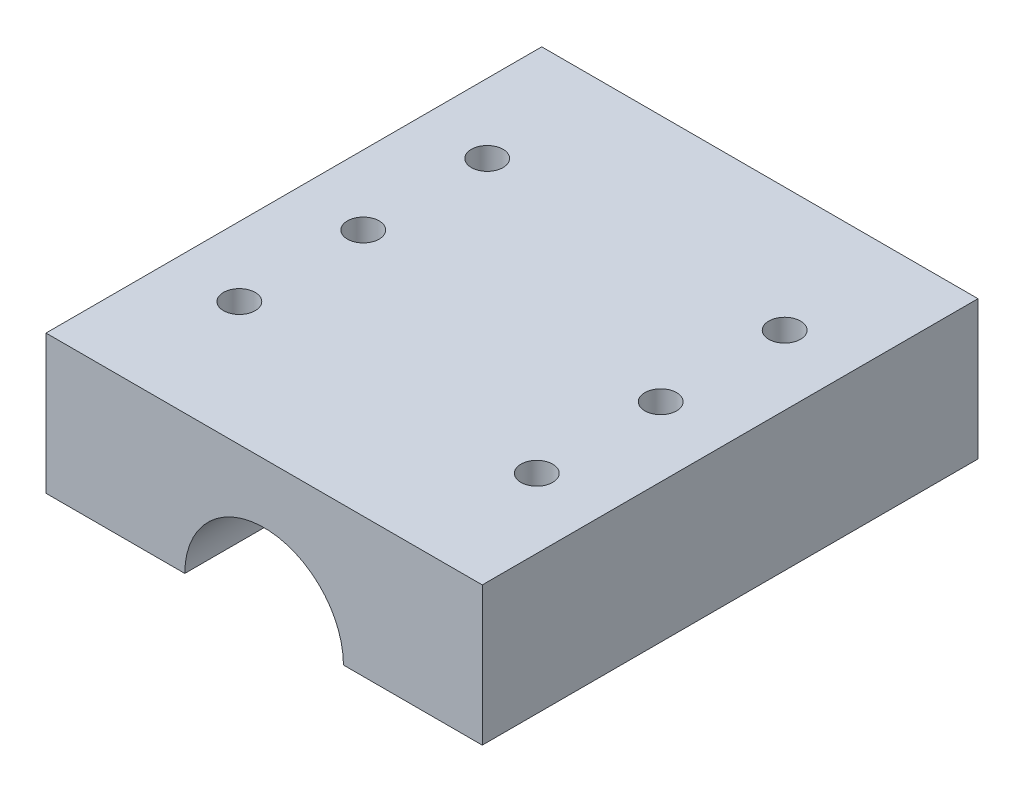
ISO-10303-21;
HEADER;
FILE_DESCRIPTION(('STEP AP214'),'2;1');
FILE_NAME('part.step','',(''),(''),'','','');
FILE_SCHEMA(('AUTOMOTIVE_DESIGN { 1 0 10303 214 1 1 1 1 }'));
ENDSEC;
DATA;
#1=APPLICATION_CONTEXT('core data for automotive mechanical design processes');
#2=APPLICATION_PROTOCOL_DEFINITION('international standard','automotive_design',2000,#1);
#3=PRODUCT_CONTEXT('',#1,'mechanical');
#4=PRODUCT('Part','Part','',(#3));
#5=PRODUCT_RELATED_PRODUCT_CATEGORY('part','',(#4));
#6=PRODUCT_DEFINITION_FORMATION('','',#4);
#7=PRODUCT_DEFINITION_CONTEXT('part definition',#1,'design');
#8=PRODUCT_DEFINITION('design','',#6,#7);
#9=PRODUCT_DEFINITION_SHAPE('','',#8);
#10=(LENGTH_UNIT() NAMED_UNIT(*) SI_UNIT(.MILLI.,.METRE.));
#11=(NAMED_UNIT(*) PLANE_ANGLE_UNIT() SI_UNIT($,.RADIAN.));
#12=(NAMED_UNIT(*) SI_UNIT($,.STERADIAN.) SOLID_ANGLE_UNIT());
#13=UNCERTAINTY_MEASURE_WITH_UNIT(LENGTH_MEASURE(1.E-05),#10,'distance_accuracy_value','');
#14=(GEOMETRIC_REPRESENTATION_CONTEXT(3) GLOBAL_UNCERTAINTY_ASSIGNED_CONTEXT((#13)) GLOBAL_UNIT_ASSIGNED_CONTEXT((#10,
#11,#12)) REPRESENTATION_CONTEXT('',''));
#15=CARTESIAN_POINT('',(0.,0.,0.));
#16=DIRECTION('',(0.,0.,1.));
#17=DIRECTION('',(1.,0.,0.));
#18=AXIS2_PLACEMENT_3D('',#15,#16,#17);
#19=CARTESIAN_POINT('',(22.,0.,-50.));
#20=DIRECTION('',(1.,0.,0.));
#21=DIRECTION('',(0.,0.,-1.));
#22=AXIS2_PLACEMENT_3D('',#19,#20,#21);
#23=PLANE('',#22);
#24=DIRECTION('',(0.,1.,0.));
#25=VECTOR('',#24,1.);
#26=CARTESIAN_POINT('',(22.,0.,0.));
#27=LINE('',#26,#25);
#28=CARTESIAN_POINT('',(22.,0.,0.));
#29=VERTEX_POINT('',#28);
#30=CARTESIAN_POINT('',(22.,14.,0.));
#31=VERTEX_POINT('',#30);
#32=EDGE_CURVE('E122',#29,#31,#27,.T.);
#33=ORIENTED_EDGE('',*,*,#32,.F.);
#34=DIRECTION('',(0.,0.,1.));
#35=VECTOR('',#34,1.);
#36=CARTESIAN_POINT('',(22.,0.,-50.));
#37=LINE('',#36,#35);
#38=CARTESIAN_POINT('',(22.,0.,-50.));
#39=VERTEX_POINT('',#38);
#40=EDGE_CURVE('E11',#39,#29,#37,.T.);
#41=ORIENTED_EDGE('',*,*,#40,.F.);
#42=DIRECTION('',(0.,1.,0.));
#43=VECTOR('',#42,1.);
#44=CARTESIAN_POINT('',(22.,0.,-50.));
#45=LINE('',#44,#43);
#46=CARTESIAN_POINT('',(22.,14.,-50.));
#47=VERTEX_POINT('',#46);
#48=EDGE_CURVE('E137',#39,#47,#45,.T.);
#49=ORIENTED_EDGE('',*,*,#48,.T.);
#50=DIRECTION('',(0.,0.,1.));
#51=VECTOR('',#50,1.);
#52=CARTESIAN_POINT('',(22.,14.,-50.));
#53=LINE('',#52,#51);
#54=EDGE_CURVE('E40',#47,#31,#53,.T.);
#55=ORIENTED_EDGE('',*,*,#54,.T.);
#56=EDGE_LOOP('',(#33,#41,#49,#55));
#57=FACE_BOUND('',#56,.T.);
#58=ADVANCED_FACE('F37',(#57),#23,.T.);
#59=CARTESIAN_POINT('',(8.,0.,-50.));
#60=DIRECTION('',(0.,-1.,0.));
#61=DIRECTION('',(1.,0.,0.));
#62=AXIS2_PLACEMENT_3D('',#59,#60,#61);
#63=PLANE('',#62);
#64=CARTESIAN_POINT('',(15.,0.,-12.5));
#65=DIRECTION('',(0.,1.,0.));
#66=DIRECTION('',(1.,0.,0.));
#67=AXIS2_PLACEMENT_3D('',#64,#65,#66);
#68=CIRCLE('',#67,1.6);
#69=CARTESIAN_POINT('',(16.6,0.,-12.5));
#70=VERTEX_POINT('',#69);
#71=EDGE_CURVE('E208',#70,#70,#68,.T.);
#72=ORIENTED_EDGE('',*,*,#71,.T.);
#73=EDGE_LOOP('',(#72));
#74=FACE_BOUND('',#73,.T.);
#75=CARTESIAN_POINT('',(15.,0.,-37.5));
#76=DIRECTION('',(0.,1.,0.));
#77=DIRECTION('',(1.,0.,0.));
#78=AXIS2_PLACEMENT_3D('',#75,#76,#77);
#79=CIRCLE('',#78,1.6);
#80=CARTESIAN_POINT('',(16.6,0.,-37.5));
#81=VERTEX_POINT('',#80);
#82=EDGE_CURVE('E203',#81,#81,#79,.T.);
#83=ORIENTED_EDGE('',*,*,#82,.T.);
#84=EDGE_LOOP('',(#83));
#85=FACE_BOUND('',#84,.T.);
#86=CARTESIAN_POINT('',(15.,0.,-25.));
#87=DIRECTION('',(0.,1.,0.));
#88=DIRECTION('',(1.,0.,0.));
#89=AXIS2_PLACEMENT_3D('',#86,#87,#88);
#90=CIRCLE('',#89,1.6);
#91=CARTESIAN_POINT('',(16.6,0.,-25.));
#92=VERTEX_POINT('',#91);
#93=EDGE_CURVE('E204',#92,#92,#90,.T.);
#94=ORIENTED_EDGE('',*,*,#93,.T.);
#95=EDGE_LOOP('',(#94));
#96=FACE_BOUND('',#95,.T.);
#97=DIRECTION('',(1.,0.,0.));
#98=VECTOR('',#97,1.);
#99=CARTESIAN_POINT('',(8.,0.,0.));
#100=LINE('',#99,#98);
#101=CARTESIAN_POINT('',(8.,0.,0.));
#102=VERTEX_POINT('',#101);
#103=EDGE_CURVE('E135',#102,#29,#100,.T.);
#104=ORIENTED_EDGE('',*,*,#103,.F.);
#105=DIRECTION('',(0.,0.,1.));
#106=VECTOR('',#105,1.);
#107=CARTESIAN_POINT('',(8.,0.,-50.));
#108=LINE('',#107,#106);
#109=CARTESIAN_POINT('',(8.,0.,-50.));
#110=VERTEX_POINT('',#109);
#111=EDGE_CURVE('E46',#110,#102,#108,.T.);
#112=ORIENTED_EDGE('',*,*,#111,.F.);
#113=DIRECTION('',(1.,0.,0.));
#114=VECTOR('',#113,1.);
#115=CARTESIAN_POINT('',(8.,0.,-50.));
#116=LINE('',#115,#114);
#117=EDGE_CURVE('E112',#110,#39,#116,.T.);
#118=ORIENTED_EDGE('',*,*,#117,.T.);
#119=ORIENTED_EDGE('',*,*,#40,.T.);
#120=EDGE_LOOP('',(#104,#112,#118,#119));
#121=FACE_BOUND('',#120,.T.);
#122=ADVANCED_FACE('F145',(#74,#85,#96,#121),#63,.T.);
#123=CARTESIAN_POINT('',(0.,0.,-50.));
#124=DIRECTION('',(0.,0.,1.));
#125=DIRECTION('',(1.,0.,0.));
#126=AXIS2_PLACEMENT_3D('',#123,#124,#125);
#127=CYLINDRICAL_SURFACE('',#126,8.);
#128=CARTESIAN_POINT('',(0.,0.,0.));
#129=DIRECTION('',(0.,0.,-1.));
#130=DIRECTION('',(1.,0.,0.));
#131=AXIS2_PLACEMENT_3D('',#128,#129,#130);
#132=CIRCLE('',#131,8.);
#133=CARTESIAN_POINT('',(-8.,0.,0.));
#134=VERTEX_POINT('',#133);
#135=EDGE_CURVE('E99',#134,#102,#132,.T.);
#136=ORIENTED_EDGE('',*,*,#135,.F.);
#137=DIRECTION('',(0.,0.,1.));
#138=VECTOR('',#137,1.);
#139=CARTESIAN_POINT('',(-8.,0.,-50.));
#140=LINE('',#139,#138);
#141=CARTESIAN_POINT('',(-8.,0.,-50.));
#142=VERTEX_POINT('',#141);
#143=EDGE_CURVE('E94',#142,#134,#140,.T.);
#144=ORIENTED_EDGE('',*,*,#143,.F.);
#145=CARTESIAN_POINT('',(0.,0.,-50.));
#146=DIRECTION('',(0.,0.,-1.));
#147=DIRECTION('',(1.,0.,0.));
#148=AXIS2_PLACEMENT_3D('',#145,#146,#147);
#149=CIRCLE('',#148,8.);
#150=EDGE_CURVE('E97',#142,#110,#149,.T.);
#151=ORIENTED_EDGE('',*,*,#150,.T.);
#152=ORIENTED_EDGE('',*,*,#111,.T.);
#153=EDGE_LOOP('',(#136,#144,#151,#152));
#154=FACE_BOUND('',#153,.T.);
#155=ADVANCED_FACE('F96',(#154),#127,.F.);
#156=CARTESIAN_POINT('',(-8.,0.,-50.));
#157=DIRECTION('',(0.,-1.,0.));
#158=DIRECTION('',(1.,0.,0.));
#159=AXIS2_PLACEMENT_3D('',#156,#157,#158);
#160=PLANE('',#159);
#161=CARTESIAN_POINT('',(-15.,0.,-37.5));
#162=DIRECTION('',(0.,1.,0.));
#163=DIRECTION('',(-1.,0.,0.));
#164=AXIS2_PLACEMENT_3D('',#161,#162,#163);
#165=CIRCLE('',#164,1.6);
#166=CARTESIAN_POINT('',(-16.6,0.,-37.5));
#167=VERTEX_POINT('',#166);
#168=EDGE_CURVE('E194',#167,#167,#165,.T.);
#169=ORIENTED_EDGE('',*,*,#168,.T.);
#170=EDGE_LOOP('',(#169));
#171=FACE_BOUND('',#170,.T.);
#172=CARTESIAN_POINT('',(-15.,0.,-12.5));
#173=DIRECTION('',(0.,1.,0.));
#174=DIRECTION('',(-1.,0.,0.));
#175=AXIS2_PLACEMENT_3D('',#172,#173,#174);
#176=CIRCLE('',#175,1.6);
#177=CARTESIAN_POINT('',(-16.6,0.,-12.5));
#178=VERTEX_POINT('',#177);
#179=EDGE_CURVE('E211',#178,#178,#176,.T.);
#180=ORIENTED_EDGE('',*,*,#179,.T.);
#181=EDGE_LOOP('',(#180));
#182=FACE_BOUND('',#181,.T.);
#183=CARTESIAN_POINT('',(-15.,0.,-25.));
#184=DIRECTION('',(0.,1.,0.));
#185=DIRECTION('',(-1.,0.,0.));
#186=AXIS2_PLACEMENT_3D('',#183,#184,#185);
#187=CIRCLE('',#186,1.6);
#188=CARTESIAN_POINT('',(-16.6,0.,-25.));
#189=VERTEX_POINT('',#188);
#190=EDGE_CURVE('E126',#189,#189,#187,.T.);
#191=ORIENTED_EDGE('',*,*,#190,.T.);
#192=EDGE_LOOP('',(#191));
#193=FACE_BOUND('',#192,.T.);
#194=DIRECTION('',(1.,0.,0.));
#195=VECTOR('',#194,1.);
#196=CARTESIAN_POINT('',(-8.,0.,0.));
#197=LINE('',#196,#195);
#198=CARTESIAN_POINT('',(-22.,0.,0.));
#199=VERTEX_POINT('',#198);
#200=EDGE_CURVE('E132',#199,#134,#197,.T.);
#201=ORIENTED_EDGE('',*,*,#200,.F.);
#202=DIRECTION('',(0.,0.,1.));
#203=VECTOR('',#202,1.);
#204=CARTESIAN_POINT('',(-22.,0.,-50.));
#205=LINE('',#204,#203);
#206=CARTESIAN_POINT('',(-22.,0.,-50.));
#207=VERTEX_POINT('',#206);
#208=EDGE_CURVE('E104',#207,#199,#205,.T.);
#209=ORIENTED_EDGE('',*,*,#208,.F.);
#210=DIRECTION('',(1.,0.,0.));
#211=VECTOR('',#210,1.);
#212=CARTESIAN_POINT('',(-8.,0.,-50.));
#213=LINE('',#212,#211);
#214=EDGE_CURVE('E110',#207,#142,#213,.T.);
#215=ORIENTED_EDGE('',*,*,#214,.T.);
#216=ORIENTED_EDGE('',*,*,#143,.T.);
#217=EDGE_LOOP('',(#201,#209,#215,#216));
#218=FACE_BOUND('',#217,.T.);
#219=ADVANCED_FACE('F114',(#171,#182,#193,#218),#160,.T.);
#220=CARTESIAN_POINT('',(-22.,0.,-50.));
#221=DIRECTION('',(-1.,0.,0.));
#222=DIRECTION('',(0.,0.,1.));
#223=AXIS2_PLACEMENT_3D('',#220,#221,#222);
#224=PLANE('',#223);
#225=DIRECTION('',(0.,-1.,0.));
#226=VECTOR('',#225,1.);
#227=CARTESIAN_POINT('',(-22.,0.,0.));
#228=LINE('',#227,#226);
#229=CARTESIAN_POINT('',(-22.,14.,0.));
#230=VERTEX_POINT('',#229);
#231=EDGE_CURVE('E129',#230,#199,#228,.T.);
#232=ORIENTED_EDGE('',*,*,#231,.F.);
#233=DIRECTION('',(0.,0.,1.));
#234=VECTOR('',#233,1.);
#235=CARTESIAN_POINT('',(-22.,14.,-50.));
#236=LINE('',#235,#234);
#237=CARTESIAN_POINT('',(-22.,14.,-50.));
#238=VERTEX_POINT('',#237);
#239=EDGE_CURVE('E140',#238,#230,#236,.T.);
#240=ORIENTED_EDGE('',*,*,#239,.F.);
#241=DIRECTION('',(0.,-1.,0.));
#242=VECTOR('',#241,1.);
#243=CARTESIAN_POINT('',(-22.,0.,-50.));
#244=LINE('',#243,#242);
#245=EDGE_CURVE('E115',#238,#207,#244,.T.);
#246=ORIENTED_EDGE('',*,*,#245,.T.);
#247=ORIENTED_EDGE('',*,*,#208,.T.);
#248=EDGE_LOOP('',(#232,#240,#246,#247));
#249=FACE_BOUND('',#248,.T.);
#250=ADVANCED_FACE('F161',(#249),#224,.T.);
#251=CARTESIAN_POINT('',(-22.,14.,-50.));
#252=DIRECTION('',(0.,1.,0.));
#253=DIRECTION('',(-1.,0.,0.));
#254=AXIS2_PLACEMENT_3D('',#251,#252,#253);
#255=PLANE('',#254);
#256=CARTESIAN_POINT('',(-15.,14.,-37.5));
#257=DIRECTION('',(0.,1.,0.));
#258=DIRECTION('',(-1.,0.,0.));
#259=AXIS2_PLACEMENT_3D('',#256,#257,#258);
#260=CIRCLE('',#259,1.6);
#261=CARTESIAN_POINT('',(-16.6,14.,-37.5));
#262=VERTEX_POINT('',#261);
#263=EDGE_CURVE('E173',#262,#262,#260,.T.);
#264=ORIENTED_EDGE('',*,*,#263,.F.);
#265=EDGE_LOOP('',(#264));
#266=FACE_BOUND('',#265,.T.);
#267=CARTESIAN_POINT('',(-15.,14.,-12.5));
#268=DIRECTION('',(0.,1.,0.));
#269=DIRECTION('',(-1.,0.,0.));
#270=AXIS2_PLACEMENT_3D('',#267,#268,#269);
#271=CIRCLE('',#270,1.6);
#272=CARTESIAN_POINT('',(-16.6,14.,-12.5));
#273=VERTEX_POINT('',#272);
#274=EDGE_CURVE('E177',#273,#273,#271,.T.);
#275=ORIENTED_EDGE('',*,*,#274,.F.);
#276=EDGE_LOOP('',(#275));
#277=FACE_BOUND('',#276,.T.);
#278=CARTESIAN_POINT('',(15.,14.,-12.5));
#279=DIRECTION('',(0.,1.,0.));
#280=DIRECTION('',(1.,0.,0.));
#281=AXIS2_PLACEMENT_3D('',#278,#279,#280);
#282=CIRCLE('',#281,1.6);
#283=CARTESIAN_POINT('',(16.6,14.,-12.5));
#284=VERTEX_POINT('',#283);
#285=EDGE_CURVE('E181',#284,#284,#282,.T.);
#286=ORIENTED_EDGE('',*,*,#285,.F.);
#287=EDGE_LOOP('',(#286));
#288=FACE_BOUND('',#287,.T.);
#289=CARTESIAN_POINT('',(15.,14.,-37.5));
#290=DIRECTION('',(0.,1.,0.));
#291=DIRECTION('',(1.,0.,0.));
#292=AXIS2_PLACEMENT_3D('',#289,#290,#291);
#293=CIRCLE('',#292,1.6);
#294=CARTESIAN_POINT('',(16.6,14.,-37.5));
#295=VERTEX_POINT('',#294);
#296=EDGE_CURVE('E185',#295,#295,#293,.T.);
#297=ORIENTED_EDGE('',*,*,#296,.F.);
#298=EDGE_LOOP('',(#297));
#299=FACE_BOUND('',#298,.T.);
#300=CARTESIAN_POINT('',(15.,14.,-25.));
#301=DIRECTION('',(0.,1.,0.));
#302=DIRECTION('',(1.,0.,0.));
#303=AXIS2_PLACEMENT_3D('',#300,#301,#302);
#304=CIRCLE('',#303,1.6);
#305=CARTESIAN_POINT('',(16.6,14.,-25.));
#306=VERTEX_POINT('',#305);
#307=EDGE_CURVE('E189',#306,#306,#304,.T.);
#308=ORIENTED_EDGE('',*,*,#307,.F.);
#309=EDGE_LOOP('',(#308));
#310=FACE_BOUND('',#309,.T.);
#311=CARTESIAN_POINT('',(-15.,14.,-25.));
#312=DIRECTION('',(0.,1.,0.));
#313=DIRECTION('',(-1.,0.,0.));
#314=AXIS2_PLACEMENT_3D('',#311,#312,#313);
#315=CIRCLE('',#314,1.6);
#316=CARTESIAN_POINT('',(-16.6,14.,-25.));
#317=VERTEX_POINT('',#316);
#318=EDGE_CURVE('E192',#317,#317,#315,.T.);
#319=ORIENTED_EDGE('',*,*,#318,.F.);
#320=EDGE_LOOP('',(#319));
#321=FACE_BOUND('',#320,.T.);
#322=DIRECTION('',(-1.,0.,0.));
#323=VECTOR('',#322,1.);
#324=CARTESIAN_POINT('',(-22.,14.,0.));
#325=LINE('',#324,#323);
#326=EDGE_CURVE('E125',#31,#230,#325,.T.);
#327=ORIENTED_EDGE('',*,*,#326,.F.);
#328=ORIENTED_EDGE('',*,*,#54,.F.);
#329=DIRECTION('',(-1.,0.,0.));
#330=VECTOR('',#329,1.);
#331=CARTESIAN_POINT('',(-22.,14.,-50.));
#332=LINE('',#331,#330);
#333=EDGE_CURVE('E117',#47,#238,#332,.T.);
#334=ORIENTED_EDGE('',*,*,#333,.T.);
#335=ORIENTED_EDGE('',*,*,#239,.T.);
#336=EDGE_LOOP('',(#327,#328,#334,#335));
#337=FACE_BOUND('',#336,.T.);
#338=ADVANCED_FACE('F142',(#266,#277,#288,#299,#310,#321,#337),#255,.T.);
#339=CARTESIAN_POINT('',(0.,0.,-50.));
#340=DIRECTION('',(0.,0.,1.));
#341=DIRECTION('',(1.,0.,0.));
#342=AXIS2_PLACEMENT_3D('',#339,#340,#341);
#343=PLANE('',#342);
#344=ORIENTED_EDGE('',*,*,#48,.F.);
#345=ORIENTED_EDGE('',*,*,#117,.F.);
#346=ORIENTED_EDGE('',*,*,#150,.F.);
#347=ORIENTED_EDGE('',*,*,#214,.F.);
#348=ORIENTED_EDGE('',*,*,#245,.F.);
#349=ORIENTED_EDGE('',*,*,#333,.F.);
#350=EDGE_LOOP('',(#344,#345,#346,#347,#348,#349));
#351=FACE_BOUND('',#350,.T.);
#352=ADVANCED_FACE('F108',(#351),#343,.F.);
#353=CARTESIAN_POINT('',(0.,0.,0.));
#354=DIRECTION('',(0.,0.,1.));
#355=DIRECTION('',(1.,0.,0.));
#356=AXIS2_PLACEMENT_3D('',#353,#354,#355);
#357=PLANE('',#356);
#358=ORIENTED_EDGE('',*,*,#32,.T.);
#359=ORIENTED_EDGE('',*,*,#326,.T.);
#360=ORIENTED_EDGE('',*,*,#231,.T.);
#361=ORIENTED_EDGE('',*,*,#200,.T.);
#362=ORIENTED_EDGE('',*,*,#135,.T.);
#363=ORIENTED_EDGE('',*,*,#103,.T.);
#364=EDGE_LOOP('',(#358,#359,#360,#361,#362,#363));
#365=FACE_BOUND('',#364,.T.);
#366=ADVANCED_FACE('F144',(#365),#357,.T.);
#367=CARTESIAN_POINT('',(-15.,0.,-25.));
#368=DIRECTION('',(0.,1.,0.));
#369=DIRECTION('',(-1.,0.,0.));
#370=AXIS2_PLACEMENT_3D('',#367,#368,#369);
#371=CYLINDRICAL_SURFACE('',#370,1.6);
#372=ORIENTED_EDGE('',*,*,#190,.F.);
#373=EDGE_LOOP('',(#372));
#374=FACE_BOUND('',#373,.T.);
#375=ORIENTED_EDGE('',*,*,#318,.T.);
#376=EDGE_LOOP('',(#375));
#377=FACE_BOUND('',#376,.T.);
#378=ADVANCED_FACE('F224',(#374,#377),#371,.F.);
#379=CARTESIAN_POINT('',(15.,0.,-25.));
#380=DIRECTION('',(0.,1.,0.));
#381=DIRECTION('',(-1.,0.,0.));
#382=AXIS2_PLACEMENT_3D('',#379,#380,#381);
#383=CYLINDRICAL_SURFACE('',#382,1.6);
#384=ORIENTED_EDGE('',*,*,#93,.F.);
#385=EDGE_LOOP('',(#384));
#386=FACE_BOUND('',#385,.T.);
#387=ORIENTED_EDGE('',*,*,#307,.T.);
#388=EDGE_LOOP('',(#387));
#389=FACE_BOUND('',#388,.T.);
#390=ADVANCED_FACE('F220',(#386,#389),#383,.F.);
#391=CARTESIAN_POINT('',(15.,0.,-37.5));
#392=DIRECTION('',(0.,1.,0.));
#393=DIRECTION('',(-1.,0.,0.));
#394=AXIS2_PLACEMENT_3D('',#391,#392,#393);
#395=CYLINDRICAL_SURFACE('',#394,1.6);
#396=ORIENTED_EDGE('',*,*,#82,.F.);
#397=EDGE_LOOP('',(#396));
#398=FACE_BOUND('',#397,.T.);
#399=ORIENTED_EDGE('',*,*,#296,.T.);
#400=EDGE_LOOP('',(#399));
#401=FACE_BOUND('',#400,.T.);
#402=ADVANCED_FACE('F223',(#398,#401),#395,.F.);
#403=CARTESIAN_POINT('',(15.,0.,-12.5));
#404=DIRECTION('',(0.,1.,0.));
#405=DIRECTION('',(-1.,0.,0.));
#406=AXIS2_PLACEMENT_3D('',#403,#404,#405);
#407=CYLINDRICAL_SURFACE('',#406,1.6);
#408=ORIENTED_EDGE('',*,*,#71,.F.);
#409=EDGE_LOOP('',(#408));
#410=FACE_BOUND('',#409,.T.);
#411=ORIENTED_EDGE('',*,*,#285,.T.);
#412=EDGE_LOOP('',(#411));
#413=FACE_BOUND('',#412,.T.);
#414=ADVANCED_FACE('F230',(#410,#413),#407,.F.);
#415=CARTESIAN_POINT('',(-15.,0.,-12.5));
#416=DIRECTION('',(0.,1.,0.));
#417=DIRECTION('',(-1.,0.,0.));
#418=AXIS2_PLACEMENT_3D('',#415,#416,#417);
#419=CYLINDRICAL_SURFACE('',#418,1.6);
#420=ORIENTED_EDGE('',*,*,#179,.F.);
#421=EDGE_LOOP('',(#420));
#422=FACE_BOUND('',#421,.T.);
#423=ORIENTED_EDGE('',*,*,#274,.T.);
#424=EDGE_LOOP('',(#423));
#425=FACE_BOUND('',#424,.T.);
#426=ADVANCED_FACE('F239',(#422,#425),#419,.F.);
#427=CARTESIAN_POINT('',(-15.,0.,-37.5));
#428=DIRECTION('',(0.,1.,0.));
#429=DIRECTION('',(-1.,0.,0.));
#430=AXIS2_PLACEMENT_3D('',#427,#428,#429);
#431=CYLINDRICAL_SURFACE('',#430,1.6);
#432=ORIENTED_EDGE('',*,*,#168,.F.);
#433=EDGE_LOOP('',(#432));
#434=FACE_BOUND('',#433,.T.);
#435=ORIENTED_EDGE('',*,*,#263,.T.);
#436=EDGE_LOOP('',(#435));
#437=FACE_BOUND('',#436,.T.);
#438=ADVANCED_FACE('F236',(#434,#437),#431,.F.);
#439=CLOSED_SHELL('',(#58,#122,#155,#219,#250,#338,#352,#366,#378,#390,#402,#414,#426,#438));
#440=MANIFOLD_SOLID_BREP('B2',#439);
#441=ADVANCED_BREP_SHAPE_REPRESENTATION('',(#18,#440),#14);
#442=SHAPE_DEFINITION_REPRESENTATION(#9,#441);
ENDSEC;
END-ISO-10303-21;
